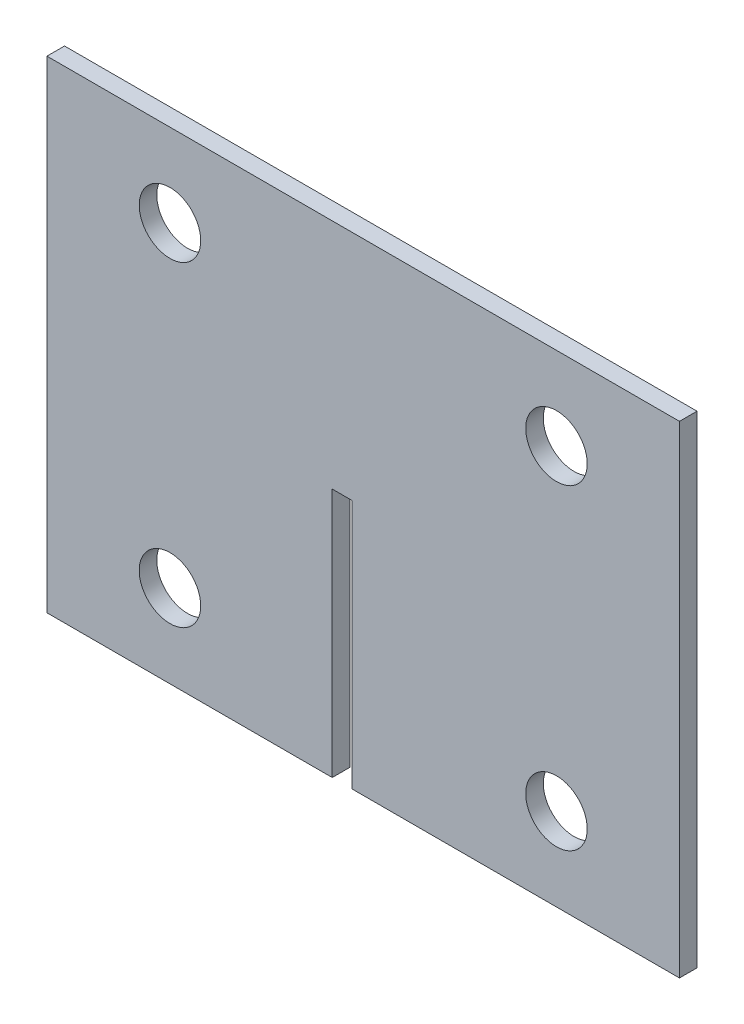
ISO-10303-21;
HEADER;
FILE_DESCRIPTION(('STEP AP214'),'2;1');
FILE_NAME('part.step','',(''),(''),'','','');
FILE_SCHEMA(('AUTOMOTIVE_DESIGN { 1 0 10303 214 1 1 1 1 }'));
ENDSEC;
DATA;
#1=APPLICATION_CONTEXT('core data for automotive mechanical design processes');
#2=APPLICATION_PROTOCOL_DEFINITION('international standard','automotive_design',2000,#1);
#3=PRODUCT_CONTEXT('',#1,'mechanical');
#4=PRODUCT('Part','Part','',(#3));
#5=PRODUCT_RELATED_PRODUCT_CATEGORY('part','',(#4));
#6=PRODUCT_DEFINITION_FORMATION('','',#4);
#7=PRODUCT_DEFINITION_CONTEXT('part definition',#1,'design');
#8=PRODUCT_DEFINITION('design','',#6,#7);
#9=PRODUCT_DEFINITION_SHAPE('','',#8);
#10=(LENGTH_UNIT() NAMED_UNIT(*) SI_UNIT(.MILLI.,.METRE.));
#11=(NAMED_UNIT(*) PLANE_ANGLE_UNIT() SI_UNIT($,.RADIAN.));
#12=(NAMED_UNIT(*) SI_UNIT($,.STERADIAN.) SOLID_ANGLE_UNIT());
#13=UNCERTAINTY_MEASURE_WITH_UNIT(LENGTH_MEASURE(1.E-05),#10,'distance_accuracy_value','');
#14=(GEOMETRIC_REPRESENTATION_CONTEXT(3) GLOBAL_UNCERTAINTY_ASSIGNED_CONTEXT((#13)) GLOBAL_UNIT_ASSIGNED_CONTEXT((#10,
#11,#12)) REPRESENTATION_CONTEXT('',''));
#15=CARTESIAN_POINT('',(0.,0.,0.));
#16=DIRECTION('',(0.,0.,1.));
#17=DIRECTION('',(1.,0.,0.));
#18=AXIS2_PLACEMENT_3D('',#15,#16,#17);
#19=CARTESIAN_POINT('',(-1647.37274698075,51.9716048524094,6.35));
#20=DIRECTION('',(0.,1.,0.));
#21=DIRECTION('',(-1.,0.,0.));
#22=AXIS2_PLACEMENT_3D('',#19,#20,#21);
#23=PLANE('',#22);
#24=DIRECTION('',(1.,0.,0.));
#25=VECTOR('',#24,1.);
#26=CARTESIAN_POINT('',(-1647.37274698075,51.9716048524094,0.));
#27=LINE('',#26,#25);
#28=CARTESIAN_POINT('',(-1647.37274698075,51.9716048524094,0.));
#29=VERTEX_POINT('',#28);
#30=CARTESIAN_POINT('',(-1544.26462198075,51.9716048524094,0.));
#31=VERTEX_POINT('',#30);
#32=EDGE_CURVE('E119',#29,#31,#27,.T.);
#33=ORIENTED_EDGE('',*,*,#32,.T.);
#34=DIRECTION('',(0.,0.,1.));
#35=VECTOR('',#34,1.);
#36=CARTESIAN_POINT('',(-1544.26462198075,51.9716048524094,-0.00100000000000013));
#37=LINE('',#36,#35);
#38=CARTESIAN_POINT('',(-1544.26462198075,51.9716048524094,6.35));
#39=VERTEX_POINT('',#38);
#40=EDGE_CURVE('E106',#31,#39,#37,.T.);
#41=ORIENTED_EDGE('',*,*,#40,.T.);
#42=DIRECTION('',(1.,0.,0.));
#43=VECTOR('',#42,1.);
#44=CARTESIAN_POINT('',(-1647.37274698075,51.9716048524094,6.35));
#45=LINE('',#44,#43);
#46=CARTESIAN_POINT('',(-1647.37274698075,51.9716048524094,6.35));
#47=VERTEX_POINT('',#46);
#48=EDGE_CURVE('E84',#47,#39,#45,.T.);
#49=ORIENTED_EDGE('',*,*,#48,.F.);
#50=DIRECTION('',(0.,0.,-1.));
#51=VECTOR('',#50,1.);
#52=CARTESIAN_POINT('',(-1647.37274698075,51.9716048524094,6.35));
#53=LINE('',#52,#51);
#54=EDGE_CURVE('E11',#47,#29,#53,.T.);
#55=ORIENTED_EDGE('',*,*,#54,.T.);
#56=EDGE_LOOP('',(#33,#41,#49,#55));
#57=FACE_BOUND('',#56,.T.);
#58=ADVANCED_FACE('F32',(#57),#23,.F.);
#59=CARTESIAN_POINT('',(-1647.37274698075,226.21560485241,6.35));
#60=DIRECTION('',(1.,0.,0.));
#61=DIRECTION('',(0.,0.,-1.));
#62=AXIS2_PLACEMENT_3D('',#59,#60,#61);
#63=PLANE('',#62);
#64=DIRECTION('',(0.,-1.,0.));
#65=VECTOR('',#64,1.);
#66=CARTESIAN_POINT('',(-1647.37274698075,226.21560485241,0.));
#67=LINE('',#66,#65);
#68=CARTESIAN_POINT('',(-1647.37274698075,226.21560485241,0.));
#69=VERTEX_POINT('',#68);
#70=EDGE_CURVE('E128',#69,#29,#67,.T.);
#71=ORIENTED_EDGE('',*,*,#70,.T.);
#72=ORIENTED_EDGE('',*,*,#54,.F.);
#73=DIRECTION('',(0.,-1.,0.));
#74=VECTOR('',#73,1.);
#75=CARTESIAN_POINT('',(-1647.37274698075,226.21560485241,6.35));
#76=LINE('',#75,#74);
#77=CARTESIAN_POINT('',(-1647.37274698075,226.21560485241,6.35));
#78=VERTEX_POINT('',#77);
#79=EDGE_CURVE('E133',#78,#47,#76,.T.);
#80=ORIENTED_EDGE('',*,*,#79,.F.);
#81=DIRECTION('',(0.,0.,-1.));
#82=VECTOR('',#81,1.);
#83=CARTESIAN_POINT('',(-1647.37274698075,226.21560485241,6.35));
#84=LINE('',#83,#82);
#85=EDGE_CURVE('E134',#78,#69,#84,.T.);
#86=ORIENTED_EDGE('',*,*,#85,.T.);
#87=EDGE_LOOP('',(#71,#72,#80,#86));
#88=FACE_BOUND('',#87,.T.);
#89=ADVANCED_FACE('F34',(#88),#63,.F.);
#90=CARTESIAN_POINT('',(-1537.12087198075,51.9716048524094,6.35));
#91=VERTEX_POINT('',#90);
#92=CARTESIAN_POINT('',(-1418.77274698075,51.9716048524095,6.35));
#93=VERTEX_POINT('',#92);
#94=EDGE_CURVE('E161',#91,#93,#45,.T.);
#95=ORIENTED_EDGE('',*,*,#94,.F.);
#96=DIRECTION('',(0.,0.,1.));
#97=VECTOR('',#96,1.);
#98=CARTESIAN_POINT('',(-1537.12087198075,51.9716048524094,-0.00100000000000013));
#99=LINE('',#98,#97);
#100=CARTESIAN_POINT('',(-1537.12087198075,51.9716048524094,0.));
#101=VERTEX_POINT('',#100);
#102=EDGE_CURVE('E113',#101,#91,#99,.T.);
#103=ORIENTED_EDGE('',*,*,#102,.F.);
#104=CARTESIAN_POINT('',(-1418.77274698075,51.9716048524095,0.));
#105=VERTEX_POINT('',#104);
#106=EDGE_CURVE('E125',#101,#105,#27,.T.);
#107=ORIENTED_EDGE('',*,*,#106,.T.);
#108=DIRECTION('',(0.,0.,-1.));
#109=VECTOR('',#108,1.);
#110=CARTESIAN_POINT('',(-1418.77274698075,51.9716048524095,6.35));
#111=LINE('',#110,#109);
#112=EDGE_CURVE('E40',#93,#105,#111,.T.);
#113=ORIENTED_EDGE('',*,*,#112,.F.);
#114=EDGE_LOOP('',(#95,#103,#107,#113));
#115=FACE_BOUND('',#114,.T.);
#116=ADVANCED_FACE('F217',(#115),#23,.F.);
#117=CARTESIAN_POINT('',(-1418.77274698075,226.21560485241,6.35));
#118=DIRECTION('',(-1.,0.,0.));
#119=DIRECTION('',(0.,0.,1.));
#120=AXIS2_PLACEMENT_3D('',#117,#118,#119);
#121=PLANE('',#120);
#122=DIRECTION('',(0.,1.,0.));
#123=VECTOR('',#122,1.);
#124=CARTESIAN_POINT('',(-1418.77274698075,226.21560485241,0.));
#125=LINE('',#124,#123);
#126=CARTESIAN_POINT('',(-1418.77274698075,226.21560485241,0.));
#127=VERTEX_POINT('',#126);
#128=EDGE_CURVE('E124',#105,#127,#125,.T.);
#129=ORIENTED_EDGE('',*,*,#128,.T.);
#130=DIRECTION('',(0.,0.,-1.));
#131=VECTOR('',#130,1.);
#132=CARTESIAN_POINT('',(-1418.77274698075,226.21560485241,6.35));
#133=LINE('',#132,#131);
#134=CARTESIAN_POINT('',(-1418.77274698075,226.21560485241,6.35));
#135=VERTEX_POINT('',#134);
#136=EDGE_CURVE('E136',#135,#127,#133,.T.);
#137=ORIENTED_EDGE('',*,*,#136,.F.);
#138=DIRECTION('',(0.,1.,0.));
#139=VECTOR('',#138,1.);
#140=CARTESIAN_POINT('',(-1418.77274698075,226.21560485241,6.35));
#141=LINE('',#140,#139);
#142=EDGE_CURVE('E144',#93,#135,#141,.T.);
#143=ORIENTED_EDGE('',*,*,#142,.F.);
#144=ORIENTED_EDGE('',*,*,#112,.T.);
#145=EDGE_LOOP('',(#129,#137,#143,#144));
#146=FACE_BOUND('',#145,.T.);
#147=ADVANCED_FACE('F142',(#146),#121,.F.);
#148=CARTESIAN_POINT('',(-1647.37274698075,226.21560485241,6.35));
#149=DIRECTION('',(0.,-1.,0.));
#150=DIRECTION('',(0.,0.,-1.));
#151=AXIS2_PLACEMENT_3D('',#148,#149,#150);
#152=PLANE('',#151);
#153=DIRECTION('',(-1.,0.,0.));
#154=VECTOR('',#153,1.);
#155=CARTESIAN_POINT('',(-1647.37274698075,226.21560485241,0.));
#156=LINE('',#155,#154);
#157=EDGE_CURVE('E77',#127,#69,#156,.T.);
#158=ORIENTED_EDGE('',*,*,#157,.T.);
#159=ORIENTED_EDGE('',*,*,#85,.F.);
#160=DIRECTION('',(-1.,0.,0.));
#161=VECTOR('',#160,1.);
#162=CARTESIAN_POINT('',(-1647.37274698075,226.21560485241,6.35));
#163=LINE('',#162,#161);
#164=EDGE_CURVE('E56',#135,#78,#163,.T.);
#165=ORIENTED_EDGE('',*,*,#164,.F.);
#166=ORIENTED_EDGE('',*,*,#136,.T.);
#167=EDGE_LOOP('',(#158,#159,#165,#166));
#168=FACE_BOUND('',#167,.T.);
#169=ADVANCED_FACE('F166',(#168),#152,.F.);
#170=CARTESIAN_POINT('',(-1647.37274698075,51.9716048524094,6.35));
#171=DIRECTION('',(0.,0.,1.));
#172=DIRECTION('',(1.,0.,0.));
#173=AXIS2_PLACEMENT_3D('',#170,#171,#172);
#174=PLANE('',#173);
#175=DIRECTION('',(0.,-1.,0.));
#176=VECTOR('',#175,1.);
#177=CARTESIAN_POINT('',(-1544.26462198075,142.26860485241,6.35));
#178=LINE('',#177,#176);
#179=CARTESIAN_POINT('',(-1544.26462198075,142.26860485241,6.35));
#180=VERTEX_POINT('',#179);
#181=EDGE_CURVE('E111',#180,#39,#178,.T.);
#182=ORIENTED_EDGE('',*,*,#181,.F.);
#183=DIRECTION('',(-1.,0.,0.));
#184=VECTOR('',#183,1.);
#185=CARTESIAN_POINT('',(-1544.26462198075,142.26860485241,6.35));
#186=LINE('',#185,#184);
#187=CARTESIAN_POINT('',(-1537.12087198075,142.26860485241,6.35));
#188=VERTEX_POINT('',#187);
#189=EDGE_CURVE('E114',#188,#180,#186,.T.);
#190=ORIENTED_EDGE('',*,*,#189,.F.);
#191=DIRECTION('',(0.,1.,0.));
#192=VECTOR('',#191,1.);
#193=CARTESIAN_POINT('',(-1537.12087198075,142.26860485241,6.35));
#194=LINE('',#193,#192);
#195=EDGE_CURVE('E170',#91,#188,#194,.T.);
#196=ORIENTED_EDGE('',*,*,#195,.F.);
#197=ORIENTED_EDGE('',*,*,#94,.T.);
#198=ORIENTED_EDGE('',*,*,#142,.T.);
#199=ORIENTED_EDGE('',*,*,#164,.T.);
#200=ORIENTED_EDGE('',*,*,#79,.T.);
#201=ORIENTED_EDGE('',*,*,#48,.T.);
#202=EDGE_LOOP('',(#182,#190,#196,#197,#198,#199,#200,#201));
#203=FACE_BOUND('',#202,.T.);
#204=CARTESIAN_POINT('',(-1602.92274698075,81.9436048524095,6.35));
#205=DIRECTION('',(0.,0.,1.));
#206=DIRECTION('',(1.,0.,0.));
#207=AXIS2_PLACEMENT_3D('',#204,#205,#206);
#208=CIRCLE('',#207,11.1125000000001);
#209=CARTESIAN_POINT('',(-1591.81024698075,81.9436048524095,6.35));
#210=VERTEX_POINT('',#209);
#211=EDGE_CURVE('E179',#210,#210,#208,.T.);
#212=ORIENTED_EDGE('',*,*,#211,.F.);
#213=EDGE_LOOP('',(#212));
#214=FACE_BOUND('',#213,.T.);
#215=CARTESIAN_POINT('',(-1602.92274698075,196.24360485241,6.35));
#216=DIRECTION('',(0.,0.,1.));
#217=DIRECTION('',(1.,0.,0.));
#218=AXIS2_PLACEMENT_3D('',#215,#216,#217);
#219=CIRCLE('',#218,11.1125000000001);
#220=CARTESIAN_POINT('',(-1591.81024698075,196.24360485241,6.35));
#221=VERTEX_POINT('',#220);
#222=EDGE_CURVE('E188',#221,#221,#219,.T.);
#223=ORIENTED_EDGE('',*,*,#222,.F.);
#224=EDGE_LOOP('',(#223));
#225=FACE_BOUND('',#224,.T.);
#226=CARTESIAN_POINT('',(-1463.22274698075,81.9436048524095,6.35));
#227=DIRECTION('',(0.,0.,1.));
#228=DIRECTION('',(1.,0.,0.));
#229=AXIS2_PLACEMENT_3D('',#226,#227,#228);
#230=CIRCLE('',#229,11.1125000000001);
#231=CARTESIAN_POINT('',(-1452.11024698075,81.9436048524095,6.35));
#232=VERTEX_POINT('',#231);
#233=EDGE_CURVE('E194',#232,#232,#230,.T.);
#234=ORIENTED_EDGE('',*,*,#233,.F.);
#235=EDGE_LOOP('',(#234));
#236=FACE_BOUND('',#235,.T.);
#237=CARTESIAN_POINT('',(-1463.22274698075,196.24360485241,6.35));
#238=DIRECTION('',(0.,0.,1.));
#239=DIRECTION('',(1.,0.,0.));
#240=AXIS2_PLACEMENT_3D('',#237,#238,#239);
#241=CIRCLE('',#240,11.1125000000001);
#242=CARTESIAN_POINT('',(-1452.11024698075,196.24360485241,6.35));
#243=VERTEX_POINT('',#242);
#244=EDGE_CURVE('E151',#243,#243,#241,.T.);
#245=ORIENTED_EDGE('',*,*,#244,.F.);
#246=EDGE_LOOP('',(#245));
#247=FACE_BOUND('',#246,.T.);
#248=ADVANCED_FACE('F163',(#203,#214,#225,#236,#247),#174,.T.);
#249=CARTESIAN_POINT('',(-1647.37274698075,51.9716048524094,0.));
#250=DIRECTION('',(0.,0.,1.));
#251=DIRECTION('',(1.,0.,0.));
#252=AXIS2_PLACEMENT_3D('',#249,#250,#251);
#253=PLANE('',#252);
#254=CARTESIAN_POINT('',(-1602.92274698075,81.9436048524095,0.));
#255=DIRECTION('',(0.,0.,1.));
#256=DIRECTION('',(1.,0.,0.));
#257=AXIS2_PLACEMENT_3D('',#254,#255,#256);
#258=CIRCLE('',#257,11.1125000000001);
#259=CARTESIAN_POINT('',(-1591.81024698075,81.9436048524095,0.));
#260=VERTEX_POINT('',#259);
#261=EDGE_CURVE('E185',#260,#260,#258,.F.);
#262=ORIENTED_EDGE('',*,*,#261,.F.);
#263=EDGE_LOOP('',(#262));
#264=FACE_BOUND('',#263,.T.);
#265=CARTESIAN_POINT('',(-1602.92274698075,196.24360485241,0.));
#266=DIRECTION('',(0.,0.,1.));
#267=DIRECTION('',(1.,0.,0.));
#268=AXIS2_PLACEMENT_3D('',#265,#266,#267);
#269=CIRCLE('',#268,11.1125000000001);
#270=CARTESIAN_POINT('',(-1591.81024698075,196.24360485241,0.));
#271=VERTEX_POINT('',#270);
#272=EDGE_CURVE('E191',#271,#271,#269,.F.);
#273=ORIENTED_EDGE('',*,*,#272,.F.);
#274=EDGE_LOOP('',(#273));
#275=FACE_BOUND('',#274,.T.);
#276=CARTESIAN_POINT('',(-1463.22274698075,81.9436048524095,0.));
#277=DIRECTION('',(0.,0.,1.));
#278=DIRECTION('',(1.,0.,0.));
#279=AXIS2_PLACEMENT_3D('',#276,#277,#278);
#280=CIRCLE('',#279,11.1125000000001);
#281=CARTESIAN_POINT('',(-1452.11024698075,81.9436048524095,0.));
#282=VERTEX_POINT('',#281);
#283=EDGE_CURVE('E156',#282,#282,#280,.F.);
#284=ORIENTED_EDGE('',*,*,#283,.F.);
#285=EDGE_LOOP('',(#284));
#286=FACE_BOUND('',#285,.T.);
#287=CARTESIAN_POINT('',(-1463.22274698075,196.24360485241,0.));
#288=DIRECTION('',(0.,0.,1.));
#289=DIRECTION('',(1.,0.,0.));
#290=AXIS2_PLACEMENT_3D('',#287,#288,#289);
#291=CIRCLE('',#290,11.1125000000001);
#292=CARTESIAN_POINT('',(-1452.11024698075,196.24360485241,0.));
#293=VERTEX_POINT('',#292);
#294=EDGE_CURVE('E149',#293,#293,#291,.F.);
#295=ORIENTED_EDGE('',*,*,#294,.F.);
#296=EDGE_LOOP('',(#295));
#297=FACE_BOUND('',#296,.T.);
#298=DIRECTION('',(1.,0.,0.));
#299=VECTOR('',#298,1.);
#300=CARTESIAN_POINT('',(-1544.26462198075,142.26860485241,0.));
#301=LINE('',#300,#299);
#302=CARTESIAN_POINT('',(-1544.26462198075,142.26860485241,0.));
#303=VERTEX_POINT('',#302);
#304=CARTESIAN_POINT('',(-1537.12087198075,142.26860485241,0.));
#305=VERTEX_POINT('',#304);
#306=EDGE_CURVE('E47',#303,#305,#301,.T.);
#307=ORIENTED_EDGE('',*,*,#306,.F.);
#308=DIRECTION('',(0.,1.,0.));
#309=VECTOR('',#308,1.);
#310=CARTESIAN_POINT('',(-1544.26462198075,142.26860485241,0.));
#311=LINE('',#310,#309);
#312=EDGE_CURVE('E109',#31,#303,#311,.T.);
#313=ORIENTED_EDGE('',*,*,#312,.F.);
#314=ORIENTED_EDGE('',*,*,#32,.F.);
#315=ORIENTED_EDGE('',*,*,#70,.F.);
#316=ORIENTED_EDGE('',*,*,#157,.F.);
#317=ORIENTED_EDGE('',*,*,#128,.F.);
#318=ORIENTED_EDGE('',*,*,#106,.F.);
#319=DIRECTION('',(0.,-1.,0.));
#320=VECTOR('',#319,1.);
#321=CARTESIAN_POINT('',(-1537.12087198075,142.26860485241,0.));
#322=LINE('',#321,#320);
#323=EDGE_CURVE('E229',#305,#101,#322,.T.);
#324=ORIENTED_EDGE('',*,*,#323,.F.);
#325=EDGE_LOOP('',(#307,#313,#314,#315,#316,#317,#318,#324));
#326=FACE_BOUND('',#325,.T.);
#327=ADVANCED_FACE('F117',(#264,#275,#286,#297,#326),#253,.F.);
#328=CARTESIAN_POINT('',(-1463.22274698075,196.24360485241,-0.00100000000000013));
#329=DIRECTION('',(0.,0.,1.));
#330=DIRECTION('',(1.,0.,0.));
#331=AXIS2_PLACEMENT_3D('',#328,#329,#330);
#332=CYLINDRICAL_SURFACE('',#331,11.1125000000001);
#333=ORIENTED_EDGE('',*,*,#244,.T.);
#334=EDGE_LOOP('',(#333));
#335=FACE_BOUND('',#334,.T.);
#336=ORIENTED_EDGE('',*,*,#294,.T.);
#337=EDGE_LOOP('',(#336));
#338=FACE_BOUND('',#337,.T.);
#339=ADVANCED_FACE('F203',(#335,#338),#332,.F.);
#340=CARTESIAN_POINT('',(-1463.22274698075,81.9436048524095,-0.00100000000000013));
#341=DIRECTION('',(0.,0.,1.));
#342=DIRECTION('',(1.,0.,0.));
#343=AXIS2_PLACEMENT_3D('',#340,#341,#342);
#344=CYLINDRICAL_SURFACE('',#343,11.1125000000001);
#345=ORIENTED_EDGE('',*,*,#233,.T.);
#346=EDGE_LOOP('',(#345));
#347=FACE_BOUND('',#346,.T.);
#348=ORIENTED_EDGE('',*,*,#283,.T.);
#349=EDGE_LOOP('',(#348));
#350=FACE_BOUND('',#349,.T.);
#351=ADVANCED_FACE('F199',(#347,#350),#344,.F.);
#352=CARTESIAN_POINT('',(-1602.92274698075,196.24360485241,-0.00100000000000013));
#353=DIRECTION('',(0.,0.,1.));
#354=DIRECTION('',(1.,0.,0.));
#355=AXIS2_PLACEMENT_3D('',#352,#353,#354);
#356=CYLINDRICAL_SURFACE('',#355,11.1125000000001);
#357=ORIENTED_EDGE('',*,*,#222,.T.);
#358=EDGE_LOOP('',(#357));
#359=FACE_BOUND('',#358,.T.);
#360=ORIENTED_EDGE('',*,*,#272,.T.);
#361=EDGE_LOOP('',(#360));
#362=FACE_BOUND('',#361,.T.);
#363=ADVANCED_FACE('F244',(#359,#362),#356,.F.);
#364=CARTESIAN_POINT('',(-1602.92274698075,81.9436048524095,-0.00100000000000013));
#365=DIRECTION('',(0.,0.,1.));
#366=DIRECTION('',(1.,0.,0.));
#367=AXIS2_PLACEMENT_3D('',#364,#365,#366);
#368=CYLINDRICAL_SURFACE('',#367,11.1125000000001);
#369=ORIENTED_EDGE('',*,*,#211,.T.);
#370=EDGE_LOOP('',(#369));
#371=FACE_BOUND('',#370,.T.);
#372=ORIENTED_EDGE('',*,*,#261,.T.);
#373=EDGE_LOOP('',(#372));
#374=FACE_BOUND('',#373,.T.);
#375=ADVANCED_FACE('F239',(#371,#374),#368,.F.);
#376=CARTESIAN_POINT('',(-1544.26462198075,142.26860485241,-0.00100000000000013));
#377=DIRECTION('',(-1.,0.,0.));
#378=DIRECTION('',(0.,0.,1.));
#379=AXIS2_PLACEMENT_3D('',#376,#377,#378);
#380=PLANE('',#379);
#381=ORIENTED_EDGE('',*,*,#312,.T.);
#382=DIRECTION('',(0.,0.,1.));
#383=VECTOR('',#382,1.);
#384=CARTESIAN_POINT('',(-1544.26462198075,142.26860485241,-0.00100000000000013));
#385=LINE('',#384,#383);
#386=EDGE_CURVE('E177',#303,#180,#385,.T.);
#387=ORIENTED_EDGE('',*,*,#386,.T.);
#388=ORIENTED_EDGE('',*,*,#181,.T.);
#389=ORIENTED_EDGE('',*,*,#40,.F.);
#390=EDGE_LOOP('',(#381,#387,#388,#389));
#391=FACE_BOUND('',#390,.T.);
#392=ADVANCED_FACE('F108',(#391),#380,.F.);
#393=CARTESIAN_POINT('',(-1544.26462198075,142.26860485241,-0.00100000000000013));
#394=DIRECTION('',(0.,1.,0.));
#395=DIRECTION('',(0.,0.,1.));
#396=AXIS2_PLACEMENT_3D('',#393,#394,#395);
#397=PLANE('',#396);
#398=ORIENTED_EDGE('',*,*,#306,.T.);
#399=DIRECTION('',(0.,0.,1.));
#400=VECTOR('',#399,1.);
#401=CARTESIAN_POINT('',(-1537.12087198075,142.26860485241,-0.00100000000000013));
#402=LINE('',#401,#400);
#403=EDGE_CURVE('E180',#305,#188,#402,.T.);
#404=ORIENTED_EDGE('',*,*,#403,.T.);
#405=ORIENTED_EDGE('',*,*,#189,.T.);
#406=ORIENTED_EDGE('',*,*,#386,.F.);
#407=EDGE_LOOP('',(#398,#404,#405,#406));
#408=FACE_BOUND('',#407,.T.);
#409=ADVANCED_FACE('F231',(#408),#397,.F.);
#410=CARTESIAN_POINT('',(-1537.12087198075,142.26860485241,-0.00100000000000013));
#411=DIRECTION('',(1.,0.,0.));
#412=DIRECTION('',(0.,0.,-1.));
#413=AXIS2_PLACEMENT_3D('',#410,#411,#412);
#414=PLANE('',#413);
#415=ORIENTED_EDGE('',*,*,#323,.T.);
#416=ORIENTED_EDGE('',*,*,#102,.T.);
#417=ORIENTED_EDGE('',*,*,#195,.T.);
#418=ORIENTED_EDGE('',*,*,#403,.F.);
#419=EDGE_LOOP('',(#415,#416,#417,#418));
#420=FACE_BOUND('',#419,.T.);
#421=ADVANCED_FACE('F228',(#420),#414,.F.);
#422=CLOSED_SHELL('',(#58,#89,#116,#147,#169,#248,#327,#339,#351,#363,#375,#392,#409,#421));
#423=MANIFOLD_SOLID_BREP('B2',#422);
#424=ADVANCED_BREP_SHAPE_REPRESENTATION('',(#18,#423),#14);
#425=SHAPE_DEFINITION_REPRESENTATION(#9,#424);
ENDSEC;
END-ISO-10303-21;
